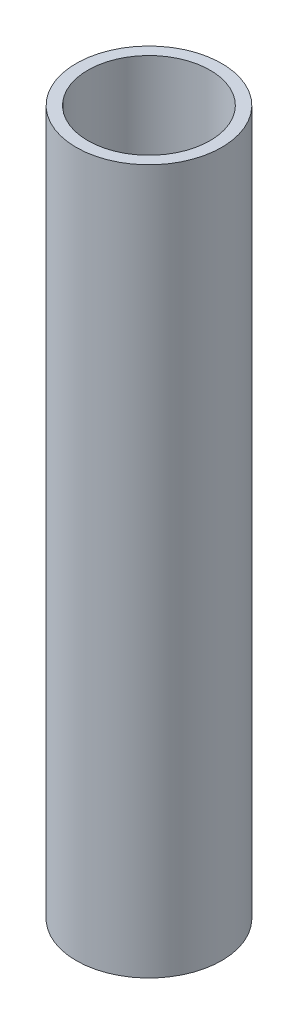
ISO-10303-21;
HEADER;
FILE_DESCRIPTION(('STEP AP214'),'2;1');
FILE_NAME('part.step','',(''),(''),'','','');
FILE_SCHEMA(('AUTOMOTIVE_DESIGN { 1 0 10303 214 1 1 1 1 }'));
ENDSEC;
DATA;
#1=APPLICATION_CONTEXT('core data for automotive mechanical design processes');
#2=APPLICATION_PROTOCOL_DEFINITION('international standard','automotive_design',2000,#1);
#3=PRODUCT_CONTEXT('',#1,'mechanical');
#4=PRODUCT('Part','Part','',(#3));
#5=PRODUCT_RELATED_PRODUCT_CATEGORY('part','',(#4));
#6=PRODUCT_DEFINITION_FORMATION('','',#4);
#7=PRODUCT_DEFINITION_CONTEXT('part definition',#1,'design');
#8=PRODUCT_DEFINITION('design','',#6,#7);
#9=PRODUCT_DEFINITION_SHAPE('','',#8);
#10=(LENGTH_UNIT() NAMED_UNIT(*) SI_UNIT(.MILLI.,.METRE.));
#11=(NAMED_UNIT(*) PLANE_ANGLE_UNIT() SI_UNIT($,.RADIAN.));
#12=(NAMED_UNIT(*) SI_UNIT($,.STERADIAN.) SOLID_ANGLE_UNIT());
#13=UNCERTAINTY_MEASURE_WITH_UNIT(LENGTH_MEASURE(1.E-05),#10,'distance_accuracy_value','');
#14=(GEOMETRIC_REPRESENTATION_CONTEXT(3) GLOBAL_UNCERTAINTY_ASSIGNED_CONTEXT((#13)) GLOBAL_UNIT_ASSIGNED_CONTEXT((#10,
#11,#12)) REPRESENTATION_CONTEXT('',''));
#15=CARTESIAN_POINT('',(0.,0.,0.));
#16=DIRECTION('',(0.,0.,1.));
#17=DIRECTION('',(1.,0.,0.));
#18=AXIS2_PLACEMENT_3D('',#15,#16,#17);
#19=CARTESIAN_POINT('',(0.,121.,0.));
#20=DIRECTION('',(0.,1.,0.));
#21=DIRECTION('',(0.,0.,1.));
#22=AXIS2_PLACEMENT_3D('',#19,#20,#21);
#23=PLANE('',#22);
#24=CARTESIAN_POINT('',(0.,121.,0.));
#25=DIRECTION('',(0.,1.,0.));
#26=DIRECTION('',(0.,0.,1.));
#27=AXIS2_PLACEMENT_3D('',#24,#25,#26);
#28=CIRCLE('',#27,12.5);
#29=CARTESIAN_POINT('',(0.,121.,12.5));
#30=VERTEX_POINT('',#29);
#31=EDGE_CURVE('E10',#30,#30,#28,.T.);
#32=ORIENTED_EDGE('',*,*,#31,.T.);
#33=EDGE_LOOP('',(#32));
#34=FACE_BOUND('',#33,.T.);
#35=CARTESIAN_POINT('',(0.,121.,0.));
#36=DIRECTION('',(0.,1.,0.));
#37=DIRECTION('',(0.,0.,1.));
#38=AXIS2_PLACEMENT_3D('',#35,#36,#37);
#39=CIRCLE('',#38,10.5);
#40=CARTESIAN_POINT('',(0.,121.,10.5));
#41=VERTEX_POINT('',#40);
#42=EDGE_CURVE('E46',#41,#41,#39,.T.);
#43=ORIENTED_EDGE('',*,*,#42,.F.);
#44=EDGE_LOOP('',(#43));
#45=FACE_BOUND('',#44,.T.);
#46=ADVANCED_FACE('F35',(#34,#45),#23,.T.);
#47=CARTESIAN_POINT('',(0.,0.,0.));
#48=DIRECTION('',(0.,1.,0.));
#49=DIRECTION('',(0.,0.,1.));
#50=AXIS2_PLACEMENT_3D('',#47,#48,#49);
#51=PLANE('',#50);
#52=CARTESIAN_POINT('',(0.,0.,0.));
#53=DIRECTION('',(0.,1.,0.));
#54=DIRECTION('',(0.,0.,1.));
#55=AXIS2_PLACEMENT_3D('',#52,#53,#54);
#56=CIRCLE('',#55,12.5);
#57=CARTESIAN_POINT('',(0.,0.,12.5));
#58=VERTEX_POINT('',#57);
#59=EDGE_CURVE('E39',#58,#58,#56,.T.);
#60=ORIENTED_EDGE('',*,*,#59,.F.);
#61=EDGE_LOOP('',(#60));
#62=FACE_BOUND('',#61,.T.);
#63=CARTESIAN_POINT('',(0.,0.,0.));
#64=DIRECTION('',(0.,1.,0.));
#65=DIRECTION('',(0.,0.,1.));
#66=AXIS2_PLACEMENT_3D('',#63,#64,#65);
#67=CIRCLE('',#66,10.5);
#68=CARTESIAN_POINT('',(0.,0.,10.5));
#69=VERTEX_POINT('',#68);
#70=EDGE_CURVE('E48',#69,#69,#67,.T.);
#71=ORIENTED_EDGE('',*,*,#70,.T.);
#72=EDGE_LOOP('',(#71));
#73=FACE_BOUND('',#72,.T.);
#74=ADVANCED_FACE('F58',(#62,#73),#51,.F.);
#75=CARTESIAN_POINT('',(0.,121.,0.));
#76=DIRECTION('',(0.,-1.,0.));
#77=DIRECTION('',(0.,0.,-1.));
#78=AXIS2_PLACEMENT_3D('',#75,#76,#77);
#79=CYLINDRICAL_SURFACE('',#78,12.5);
#80=ORIENTED_EDGE('',*,*,#31,.F.);
#81=EDGE_LOOP('',(#80));
#82=FACE_BOUND('',#81,.T.);
#83=ORIENTED_EDGE('',*,*,#59,.T.);
#84=EDGE_LOOP('',(#83));
#85=FACE_BOUND('',#84,.T.);
#86=ADVANCED_FACE('F37',(#82,#85),#79,.T.);
#87=CARTESIAN_POINT('',(0.,121.,0.));
#88=DIRECTION('',(0.,-1.,0.));
#89=DIRECTION('',(0.,0.,-1.));
#90=AXIS2_PLACEMENT_3D('',#87,#88,#89);
#91=CYLINDRICAL_SURFACE('',#90,10.5);
#92=ORIENTED_EDGE('',*,*,#42,.T.);
#93=EDGE_LOOP('',(#92));
#94=FACE_BOUND('',#93,.T.);
#95=ORIENTED_EDGE('',*,*,#70,.F.);
#96=EDGE_LOOP('',(#95));
#97=FACE_BOUND('',#96,.T.);
#98=ADVANCED_FACE('F54',(#94,#97),#91,.F.);
#99=CLOSED_SHELL('',(#46,#74,#86,#98));
#100=MANIFOLD_SOLID_BREP('B2',#99);
#101=ADVANCED_BREP_SHAPE_REPRESENTATION('',(#18,#100),#14);
#102=SHAPE_DEFINITION_REPRESENTATION(#9,#101);
ENDSEC;
END-ISO-10303-21;
